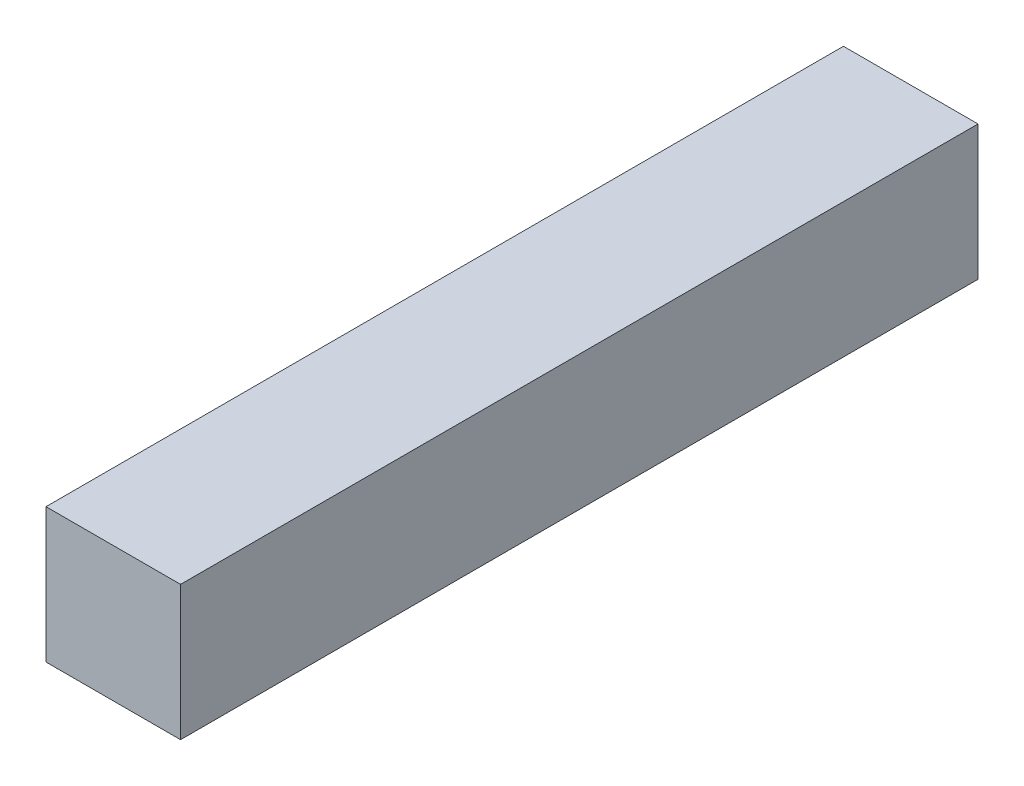
ISO-10303-21;
HEADER;
FILE_DESCRIPTION(('STEP AP214'),'2;1');
FILE_NAME('part.step','',(''),(''),'','','');
FILE_SCHEMA(('AUTOMOTIVE_DESIGN { 1 0 10303 214 1 1 1 1 }'));
ENDSEC;
DATA;
#1=APPLICATION_CONTEXT('core data for automotive mechanical design processes');
#2=APPLICATION_PROTOCOL_DEFINITION('international standard','automotive_design',2000,#1);
#3=PRODUCT_CONTEXT('',#1,'mechanical');
#4=PRODUCT('Part','Part','',(#3));
#5=PRODUCT_RELATED_PRODUCT_CATEGORY('part','',(#4));
#6=PRODUCT_DEFINITION_FORMATION('','',#4);
#7=PRODUCT_DEFINITION_CONTEXT('part definition',#1,'design');
#8=PRODUCT_DEFINITION('design','',#6,#7);
#9=PRODUCT_DEFINITION_SHAPE('','',#8);
#10=(LENGTH_UNIT() NAMED_UNIT(*) SI_UNIT(.MILLI.,.METRE.));
#11=(NAMED_UNIT(*) PLANE_ANGLE_UNIT() SI_UNIT($,.RADIAN.));
#12=(NAMED_UNIT(*) SI_UNIT($,.STERADIAN.) SOLID_ANGLE_UNIT());
#13=UNCERTAINTY_MEASURE_WITH_UNIT(LENGTH_MEASURE(1.E-05),#10,'distance_accuracy_value','');
#14=(GEOMETRIC_REPRESENTATION_CONTEXT(3) GLOBAL_UNCERTAINTY_ASSIGNED_CONTEXT((#13)) GLOBAL_UNIT_ASSIGNED_CONTEXT((#10,
#11,#12)) REPRESENTATION_CONTEXT('',''));
#15=CARTESIAN_POINT('',(0.,0.,0.));
#16=DIRECTION('',(0.,0.,1.));
#17=DIRECTION('',(1.,0.,0.));
#18=AXIS2_PLACEMENT_3D('',#15,#16,#17);
#19=CARTESIAN_POINT('',(15.,-15.,177.8));
#20=DIRECTION('',(-1.,0.,0.));
#21=DIRECTION('',(0.,0.,1.));
#22=AXIS2_PLACEMENT_3D('',#19,#20,#21);
#23=PLANE('',#22);
#24=DIRECTION('',(0.,1.,0.));
#25=VECTOR('',#24,1.);
#26=CARTESIAN_POINT('',(15.,-15.,0.));
#27=LINE('',#26,#25);
#28=CARTESIAN_POINT('',(15.,-15.,0.));
#29=VERTEX_POINT('',#28);
#30=CARTESIAN_POINT('',(15.,15.,0.));
#31=VERTEX_POINT('',#30);
#32=EDGE_CURVE('E96',#29,#31,#27,.T.);
#33=ORIENTED_EDGE('',*,*,#32,.T.);
#34=DIRECTION('',(0.,0.,-1.));
#35=VECTOR('',#34,1.);
#36=CARTESIAN_POINT('',(15.,15.,177.8));
#37=LINE('',#36,#35);
#38=CARTESIAN_POINT('',(15.,15.,177.8));
#39=VERTEX_POINT('',#38);
#40=EDGE_CURVE('E11',#39,#31,#37,.T.);
#41=ORIENTED_EDGE('',*,*,#40,.F.);
#42=DIRECTION('',(0.,1.,0.));
#43=VECTOR('',#42,1.);
#44=CARTESIAN_POINT('',(15.,-15.,177.8));
#45=LINE('',#44,#43);
#46=CARTESIAN_POINT('',(15.,-15.,177.8));
#47=VERTEX_POINT('',#46);
#48=EDGE_CURVE('E84',#47,#39,#45,.T.);
#49=ORIENTED_EDGE('',*,*,#48,.F.);
#50=DIRECTION('',(0.,0.,-1.));
#51=VECTOR('',#50,1.);
#52=CARTESIAN_POINT('',(15.,-15.,177.8));
#53=LINE('',#52,#51);
#54=EDGE_CURVE('E92',#47,#29,#53,.T.);
#55=ORIENTED_EDGE('',*,*,#54,.T.);
#56=EDGE_LOOP('',(#33,#41,#49,#55));
#57=FACE_BOUND('',#56,.T.);
#58=ADVANCED_FACE('F33',(#57),#23,.F.);
#59=CARTESIAN_POINT('',(-15.,15.,177.8));
#60=DIRECTION('',(0.,-1.,0.));
#61=DIRECTION('',(0.,0.,-1.));
#62=AXIS2_PLACEMENT_3D('',#59,#60,#61);
#63=PLANE('',#62);
#64=DIRECTION('',(-1.,0.,0.));
#65=VECTOR('',#64,1.);
#66=CARTESIAN_POINT('',(-15.,15.,0.));
#67=LINE('',#66,#65);
#68=CARTESIAN_POINT('',(-15.,15.,0.));
#69=VERTEX_POINT('',#68);
#70=EDGE_CURVE('E88',#31,#69,#67,.T.);
#71=ORIENTED_EDGE('',*,*,#70,.T.);
#72=DIRECTION('',(0.,0.,-1.));
#73=VECTOR('',#72,1.);
#74=CARTESIAN_POINT('',(-15.,15.,177.8));
#75=LINE('',#74,#73);
#76=CARTESIAN_POINT('',(-15.,15.,177.8));
#77=VERTEX_POINT('',#76);
#78=EDGE_CURVE('E41',#77,#69,#75,.T.);
#79=ORIENTED_EDGE('',*,*,#78,.F.);
#80=DIRECTION('',(-1.,0.,0.));
#81=VECTOR('',#80,1.);
#82=CARTESIAN_POINT('',(-15.,15.,177.8));
#83=LINE('',#82,#81);
#84=EDGE_CURVE('E79',#39,#77,#83,.T.);
#85=ORIENTED_EDGE('',*,*,#84,.F.);
#86=ORIENTED_EDGE('',*,*,#40,.T.);
#87=EDGE_LOOP('',(#71,#79,#85,#86));
#88=FACE_BOUND('',#87,.T.);
#89=ADVANCED_FACE('F87',(#88),#63,.F.);
#90=CARTESIAN_POINT('',(-15.,-15.,177.8));
#91=DIRECTION('',(1.,0.,0.));
#92=DIRECTION('',(0.,0.,-1.));
#93=AXIS2_PLACEMENT_3D('',#90,#91,#92);
#94=PLANE('',#93);
#95=DIRECTION('',(0.,-1.,0.));
#96=VECTOR('',#95,1.);
#97=CARTESIAN_POINT('',(-15.,-15.,0.));
#98=LINE('',#97,#96);
#99=CARTESIAN_POINT('',(-15.,-15.,0.));
#100=VERTEX_POINT('',#99);
#101=EDGE_CURVE('E66',#69,#100,#98,.T.);
#102=ORIENTED_EDGE('',*,*,#101,.T.);
#103=DIRECTION('',(0.,0.,-1.));
#104=VECTOR('',#103,1.);
#105=CARTESIAN_POINT('',(-15.,-15.,177.8));
#106=LINE('',#105,#104);
#107=CARTESIAN_POINT('',(-15.,-15.,177.8));
#108=VERTEX_POINT('',#107);
#109=EDGE_CURVE('E89',#108,#100,#106,.T.);
#110=ORIENTED_EDGE('',*,*,#109,.F.);
#111=DIRECTION('',(0.,-1.,0.));
#112=VECTOR('',#111,1.);
#113=CARTESIAN_POINT('',(-15.,-15.,177.8));
#114=LINE('',#113,#112);
#115=EDGE_CURVE('E82',#77,#108,#114,.T.);
#116=ORIENTED_EDGE('',*,*,#115,.F.);
#117=ORIENTED_EDGE('',*,*,#78,.T.);
#118=EDGE_LOOP('',(#102,#110,#116,#117));
#119=FACE_BOUND('',#118,.T.);
#120=ADVANCED_FACE('F90',(#119),#94,.F.);
#121=CARTESIAN_POINT('',(-15.,-15.,177.8));
#122=DIRECTION('',(0.,1.,0.));
#123=DIRECTION('',(0.,0.,1.));
#124=AXIS2_PLACEMENT_3D('',#121,#122,#123);
#125=PLANE('',#124);
#126=DIRECTION('',(1.,0.,0.));
#127=VECTOR('',#126,1.);
#128=CARTESIAN_POINT('',(-15.,-15.,0.));
#129=LINE('',#128,#127);
#130=EDGE_CURVE('E72',#100,#29,#129,.T.);
#131=ORIENTED_EDGE('',*,*,#130,.T.);
#132=ORIENTED_EDGE('',*,*,#54,.F.);
#133=DIRECTION('',(1.,0.,0.));
#134=VECTOR('',#133,1.);
#135=CARTESIAN_POINT('',(-15.,-15.,177.8));
#136=LINE('',#135,#134);
#137=EDGE_CURVE('E49',#108,#47,#136,.T.);
#138=ORIENTED_EDGE('',*,*,#137,.F.);
#139=ORIENTED_EDGE('',*,*,#109,.T.);
#140=EDGE_LOOP('',(#131,#132,#138,#139));
#141=FACE_BOUND('',#140,.T.);
#142=ADVANCED_FACE('F103',(#141),#125,.F.);
#143=CARTESIAN_POINT('',(0.,0.,177.8));
#144=DIRECTION('',(0.,0.,-1.));
#145=DIRECTION('',(-1.,0.,0.));
#146=AXIS2_PLACEMENT_3D('',#143,#144,#145);
#147=PLANE('',#146);
#148=ORIENTED_EDGE('',*,*,#48,.T.);
#149=ORIENTED_EDGE('',*,*,#84,.T.);
#150=ORIENTED_EDGE('',*,*,#115,.T.);
#151=ORIENTED_EDGE('',*,*,#137,.T.);
#152=EDGE_LOOP('',(#148,#149,#150,#151));
#153=FACE_BOUND('',#152,.T.);
#154=ADVANCED_FACE('F80',(#153),#147,.F.);
#155=CARTESIAN_POINT('',(0.,0.,0.));
#156=DIRECTION('',(0.,0.,-1.));
#157=DIRECTION('',(-1.,0.,0.));
#158=AXIS2_PLACEMENT_3D('',#155,#156,#157);
#159=PLANE('',#158);
#160=ORIENTED_EDGE('',*,*,#32,.F.);
#161=ORIENTED_EDGE('',*,*,#130,.F.);
#162=ORIENTED_EDGE('',*,*,#101,.F.);
#163=ORIENTED_EDGE('',*,*,#70,.F.);
#164=EDGE_LOOP('',(#160,#161,#162,#163));
#165=FACE_BOUND('',#164,.T.);
#166=ADVANCED_FACE('F106',(#165),#159,.T.);
#167=CLOSED_SHELL('',(#58,#89,#120,#142,#154,#166));
#168=MANIFOLD_SOLID_BREP('B2',#167);
#169=ADVANCED_BREP_SHAPE_REPRESENTATION('',(#18,#168),#14);
#170=SHAPE_DEFINITION_REPRESENTATION(#9,#169);
ENDSEC;
END-ISO-10303-21;
